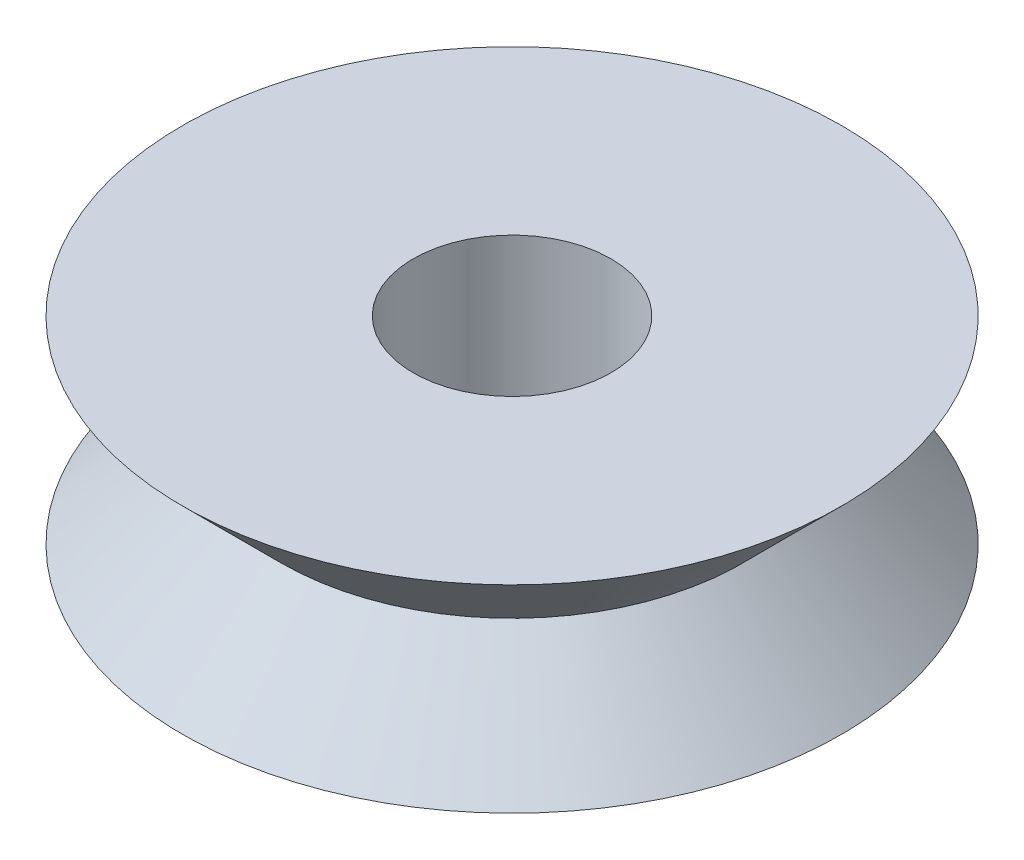
ISO-10303-21;
HEADER;
FILE_DESCRIPTION(('STEP AP214'),'2;1');
FILE_NAME('part.step','',(''),(''),'','','');
FILE_SCHEMA(('AUTOMOTIVE_DESIGN { 1 0 10303 214 1 1 1 1 }'));
ENDSEC;
DATA;
#1=APPLICATION_CONTEXT('core data for automotive mechanical design processes');
#2=APPLICATION_PROTOCOL_DEFINITION('international standard','automotive_design',2000,#1);
#3=PRODUCT_CONTEXT('',#1,'mechanical');
#4=PRODUCT('Part','Part','',(#3));
#5=PRODUCT_RELATED_PRODUCT_CATEGORY('part','',(#4));
#6=PRODUCT_DEFINITION_FORMATION('','',#4);
#7=PRODUCT_DEFINITION_CONTEXT('part definition',#1,'design');
#8=PRODUCT_DEFINITION('design','',#6,#7);
#9=PRODUCT_DEFINITION_SHAPE('','',#8);
#10=(LENGTH_UNIT() NAMED_UNIT(*) SI_UNIT(.MILLI.,.METRE.));
#11=(NAMED_UNIT(*) PLANE_ANGLE_UNIT() SI_UNIT($,.RADIAN.));
#12=(NAMED_UNIT(*) SI_UNIT($,.STERADIAN.) SOLID_ANGLE_UNIT());
#13=UNCERTAINTY_MEASURE_WITH_UNIT(LENGTH_MEASURE(1.E-05),#10,'distance_accuracy_value','');
#14=(GEOMETRIC_REPRESENTATION_CONTEXT(3) GLOBAL_UNCERTAINTY_ASSIGNED_CONTEXT((#13)) GLOBAL_UNIT_ASSIGNED_CONTEXT((#10,
#11,#12)) REPRESENTATION_CONTEXT('',''));
#15=CARTESIAN_POINT('',(0.,0.,0.));
#16=DIRECTION('',(0.,0.,1.));
#17=DIRECTION('',(1.,0.,0.));
#18=AXIS2_PLACEMENT_3D('',#15,#16,#17);
#19=CARTESIAN_POINT('',(0.,0.,0.));
#20=DIRECTION('',(0.,-1.,0.));
#21=DIRECTION('',(0.,0.,-1.));
#22=AXIS2_PLACEMENT_3D('',#19,#20,#21);
#23=CYLINDRICAL_SURFACE('',#22,1.5);
#24=CARTESIAN_POINT('',(0.,0.,0.));
#25=DIRECTION('',(0.,-1.,0.));
#26=DIRECTION('',(0.,0.,-1.));
#27=AXIS2_PLACEMENT_3D('',#24,#25,#26);
#28=CIRCLE('',#27,1.5);
#29=CARTESIAN_POINT('',(0.,0.,-1.5));
#30=VERTEX_POINT('',#29);
#31=EDGE_CURVE('E10',#30,#30,#28,.T.);
#32=ORIENTED_EDGE('',*,*,#31,.T.);
#33=EDGE_LOOP('',(#32));
#34=FACE_BOUND('',#33,.T.);
#35=CARTESIAN_POINT('',(0.,3.,0.));
#36=DIRECTION('',(0.,-1.,0.));
#37=DIRECTION('',(0.,0.,-1.));
#38=AXIS2_PLACEMENT_3D('',#35,#36,#37);
#39=CIRCLE('',#38,1.5);
#40=CARTESIAN_POINT('',(0.,3.,-1.5));
#41=VERTEX_POINT('',#40);
#42=EDGE_CURVE('E66',#41,#41,#39,.T.);
#43=ORIENTED_EDGE('',*,*,#42,.F.);
#44=EDGE_LOOP('',(#43));
#45=FACE_BOUND('',#44,.T.);
#46=ADVANCED_FACE('F43',(#34,#45),#23,.F.);
#47=CARTESIAN_POINT('',(1.5,0.,0.));
#48=DIRECTION('',(0.,-1.,0.));
#49=DIRECTION('',(0.,0.,-1.));
#50=AXIS2_PLACEMENT_3D('',#47,#48,#49);
#51=PLANE('',#50);
#52=CARTESIAN_POINT('',(0.,0.,0.));
#53=DIRECTION('',(0.,-1.,0.));
#54=DIRECTION('',(0.,0.,-1.));
#55=AXIS2_PLACEMENT_3D('',#52,#53,#54);
#56=CIRCLE('',#55,5.);
#57=CARTESIAN_POINT('',(0.,0.,-5.));
#58=VERTEX_POINT('',#57);
#59=EDGE_CURVE('E50',#58,#58,#56,.T.);
#60=ORIENTED_EDGE('',*,*,#59,.T.);
#61=EDGE_LOOP('',(#60));
#62=FACE_BOUND('',#61,.T.);
#63=ORIENTED_EDGE('',*,*,#31,.F.);
#64=EDGE_LOOP('',(#63));
#65=FACE_BOUND('',#64,.T.);
#66=ADVANCED_FACE('F75',(#62,#65),#51,.T.);
#67=CARTESIAN_POINT('',(0.,0.,0.));
#68=DIRECTION('',(0.,-1.,0.));
#69=DIRECTION('',(0.,0.,-1.));
#70=AXIS2_PLACEMENT_3D('',#67,#68,#69);
#71=CONICAL_SURFACE('',#70,5.,0.785398163397448);
#72=CARTESIAN_POINT('',(0.,1.5,0.));
#73=DIRECTION('',(0.,-1.,0.));
#74=DIRECTION('',(0.,0.,-1.));
#75=AXIS2_PLACEMENT_3D('',#72,#73,#74);
#76=CIRCLE('',#75,3.5);
#77=CARTESIAN_POINT('',(0.,1.5,-3.5));
#78=VERTEX_POINT('',#77);
#79=EDGE_CURVE('E55',#78,#78,#76,.T.);
#80=ORIENTED_EDGE('',*,*,#79,.T.);
#81=EDGE_LOOP('',(#80));
#82=FACE_BOUND('',#81,.T.);
#83=ORIENTED_EDGE('',*,*,#59,.F.);
#84=EDGE_LOOP('',(#83));
#85=FACE_BOUND('',#84,.T.);
#86=ADVANCED_FACE('F79',(#82,#85),#71,.T.);
#87=CARTESIAN_POINT('',(0.,1.5,0.));
#88=DIRECTION('',(0.,1.,0.));
#89=DIRECTION('',(0.,0.,1.));
#90=AXIS2_PLACEMENT_3D('',#87,#88,#89);
#91=CONICAL_SURFACE('',#90,3.5,0.785398163397449);
#92=CARTESIAN_POINT('',(0.,3.,0.));
#93=DIRECTION('',(0.,-1.,0.));
#94=DIRECTION('',(0.,0.,-1.));
#95=AXIS2_PLACEMENT_3D('',#92,#93,#94);
#96=CIRCLE('',#95,5.);
#97=CARTESIAN_POINT('',(0.,3.,-5.));
#98=VERTEX_POINT('',#97);
#99=EDGE_CURVE('E60',#98,#98,#96,.T.);
#100=ORIENTED_EDGE('',*,*,#99,.T.);
#101=EDGE_LOOP('',(#100));
#102=FACE_BOUND('',#101,.T.);
#103=ORIENTED_EDGE('',*,*,#79,.F.);
#104=EDGE_LOOP('',(#103));
#105=FACE_BOUND('',#104,.T.);
#106=ADVANCED_FACE('F83',(#102,#105),#91,.T.);
#107=CARTESIAN_POINT('',(5.,3.,0.));
#108=DIRECTION('',(0.,1.,0.));
#109=DIRECTION('',(0.,0.,1.));
#110=AXIS2_PLACEMENT_3D('',#107,#108,#109);
#111=PLANE('',#110);
#112=ORIENTED_EDGE('',*,*,#42,.T.);
#113=EDGE_LOOP('',(#112));
#114=FACE_BOUND('',#113,.T.);
#115=ORIENTED_EDGE('',*,*,#99,.F.);
#116=EDGE_LOOP('',(#115));
#117=FACE_BOUND('',#116,.T.);
#118=ADVANCED_FACE('F71',(#114,#117),#111,.T.);
#119=CLOSED_SHELL('',(#46,#66,#86,#106,#118));
#120=MANIFOLD_SOLID_BREP('B2',#119);
#121=ADVANCED_BREP_SHAPE_REPRESENTATION('',(#18,#120),#14);
#122=SHAPE_DEFINITION_REPRESENTATION(#9,#121);
ENDSEC;
END-ISO-10303-21;
